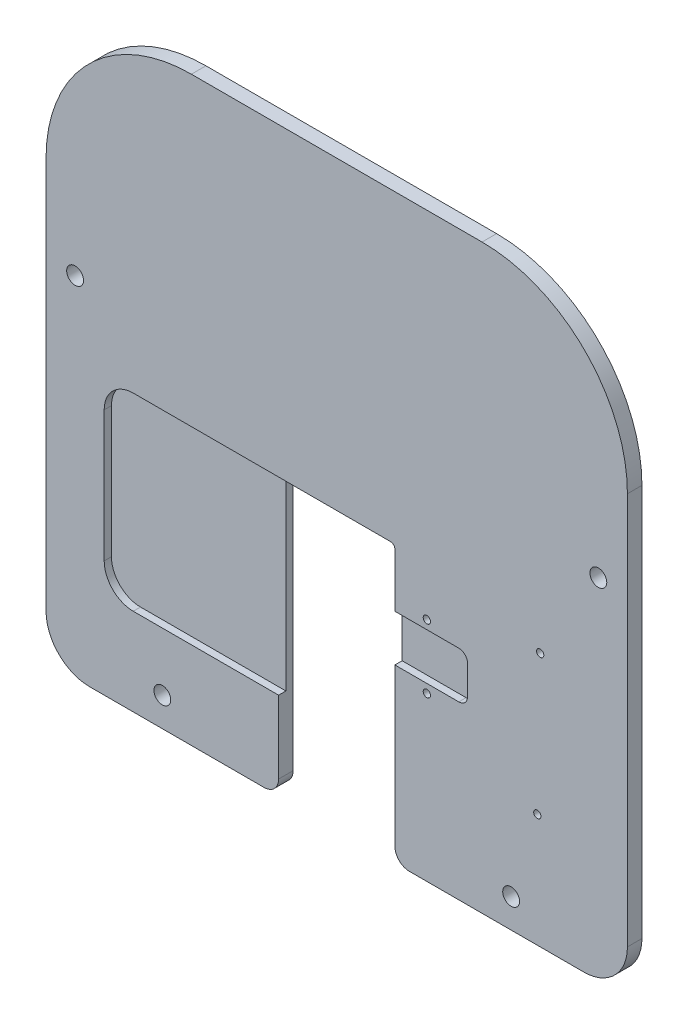
ISO-10303-21;
HEADER;
FILE_DESCRIPTION(('STEP AP214'),'2;1');
FILE_NAME('part.step','',(''),(''),'','','');
FILE_SCHEMA(('AUTOMOTIVE_DESIGN { 1 0 10303 214 1 1 1 1 }'));
ENDSEC;
DATA;
#1=APPLICATION_CONTEXT('core data for automotive mechanical design processes');
#2=APPLICATION_PROTOCOL_DEFINITION('international standard','automotive_design',2000,#1);
#3=PRODUCT_CONTEXT('',#1,'mechanical');
#4=PRODUCT('Part','Part','',(#3));
#5=PRODUCT_RELATED_PRODUCT_CATEGORY('part','',(#4));
#6=PRODUCT_DEFINITION_FORMATION('','',#4);
#7=PRODUCT_DEFINITION_CONTEXT('part definition',#1,'design');
#8=PRODUCT_DEFINITION('design','',#6,#7);
#9=PRODUCT_DEFINITION_SHAPE('','',#8);
#10=(LENGTH_UNIT() NAMED_UNIT(*) SI_UNIT(.MILLI.,.METRE.));
#11=(NAMED_UNIT(*) PLANE_ANGLE_UNIT() SI_UNIT($,.RADIAN.));
#12=(NAMED_UNIT(*) SI_UNIT($,.STERADIAN.) SOLID_ANGLE_UNIT());
#13=UNCERTAINTY_MEASURE_WITH_UNIT(LENGTH_MEASURE(1.E-05),#10,'distance_accuracy_value','');
#14=(GEOMETRIC_REPRESENTATION_CONTEXT(3) GLOBAL_UNCERTAINTY_ASSIGNED_CONTEXT((#13)) GLOBAL_UNIT_ASSIGNED_CONTEXT((#10,
#11,#12)) REPRESENTATION_CONTEXT('',''));
#15=CARTESIAN_POINT('',(0.,0.,0.));
#16=DIRECTION('',(0.,0.,1.));
#17=DIRECTION('',(1.,0.,0.));
#18=AXIS2_PLACEMENT_3D('',#15,#16,#17);
#19=CARTESIAN_POINT('',(-100.,-90.,5.));
#20=DIRECTION('',(0.,1.,0.));
#21=DIRECTION('',(-1.,0.,0.));
#22=AXIS2_PLACEMENT_3D('',#19,#20,#21);
#23=PLANE('',#22);
#24=DIRECTION('',(1.,0.,0.));
#25=VECTOR('',#24,1.);
#26=CARTESIAN_POINT('',(-100.,-90.,0.));
#27=LINE('',#26,#25);
#28=CARTESIAN_POINT('',(-85.,-90.,0.));
#29=VERTEX_POINT('',#28);
#30=CARTESIAN_POINT('',(-25.,-90.,0.));
#31=VERTEX_POINT('',#30);
#32=EDGE_CURVE('E337',#29,#31,#27,.T.);
#33=ORIENTED_EDGE('',*,*,#32,.T.);
#34=DIRECTION('',(0.,0.,1.));
#35=VECTOR('',#34,1.);
#36=CARTESIAN_POINT('',(-25.,-90.,5.));
#37=LINE('',#36,#35);
#38=CARTESIAN_POINT('',(-25.,-90.,5.));
#39=VERTEX_POINT('',#38);
#40=EDGE_CURVE('E394',#31,#39,#37,.T.);
#41=ORIENTED_EDGE('',*,*,#40,.T.);
#42=DIRECTION('',(1.,0.,0.));
#43=VECTOR('',#42,1.);
#44=CARTESIAN_POINT('',(-100.,-90.,5.));
#45=LINE('',#44,#43);
#46=CARTESIAN_POINT('',(-85.,-90.,5.));
#47=VERTEX_POINT('',#46);
#48=EDGE_CURVE('E325',#47,#39,#45,.T.);
#49=ORIENTED_EDGE('',*,*,#48,.F.);
#50=DIRECTION('',(0.,0.,-1.));
#51=VECTOR('',#50,1.);
#52=CARTESIAN_POINT('',(-85.,-90.,5.));
#53=LINE('',#52,#51);
#54=EDGE_CURVE('E374',#47,#29,#53,.T.);
#55=ORIENTED_EDGE('',*,*,#54,.T.);
#56=EDGE_LOOP('',(#33,#41,#49,#55));
#57=FACE_BOUND('',#56,.T.);
#58=ADVANCED_FACE('F31',(#57),#23,.F.);
#59=CARTESIAN_POINT('',(-100.,110.,5.));
#60=DIRECTION('',(1.,0.,0.));
#61=DIRECTION('',(0.,1.,0.));
#62=AXIS2_PLACEMENT_3D('',#59,#60,#61);
#63=PLANE('',#62);
#64=DIRECTION('',(0.,-1.,0.));
#65=VECTOR('',#64,1.);
#66=CARTESIAN_POINT('',(-100.,110.,0.));
#67=LINE('',#66,#65);
#68=CARTESIAN_POINT('',(-100.,60.,0.));
#69=VERTEX_POINT('',#68);
#70=CARTESIAN_POINT('',(-100.,-75.,0.));
#71=VERTEX_POINT('',#70);
#72=EDGE_CURVE('E319',#69,#71,#67,.T.);
#73=ORIENTED_EDGE('',*,*,#72,.T.);
#74=DIRECTION('',(0.,0.,-1.));
#75=VECTOR('',#74,1.);
#76=CARTESIAN_POINT('',(-100.,-75.,5.));
#77=LINE('',#76,#75);
#78=CARTESIAN_POINT('',(-100.,-75.,5.));
#79=VERTEX_POINT('',#78);
#80=EDGE_CURVE('E382',#71,#79,#77,.F.);
#81=ORIENTED_EDGE('',*,*,#80,.T.);
#82=DIRECTION('',(0.,-1.,0.));
#83=VECTOR('',#82,1.);
#84=CARTESIAN_POINT('',(-100.,110.,5.));
#85=LINE('',#84,#83);
#86=CARTESIAN_POINT('',(-100.,60.,5.));
#87=VERTEX_POINT('',#86);
#88=EDGE_CURVE('E320',#87,#79,#85,.T.);
#89=ORIENTED_EDGE('',*,*,#88,.F.);
#90=DIRECTION('',(0.,0.,-1.));
#91=VECTOR('',#90,1.);
#92=CARTESIAN_POINT('',(-100.,60.,5.));
#93=LINE('',#92,#91);
#94=EDGE_CURVE('E360',#87,#69,#93,.T.);
#95=ORIENTED_EDGE('',*,*,#94,.T.);
#96=EDGE_LOOP('',(#73,#81,#89,#95));
#97=FACE_BOUND('',#96,.T.);
#98=ADVANCED_FACE('F503',(#97),#63,.F.);
#99=CARTESIAN_POINT('',(25.,-90.,5.));
#100=VERTEX_POINT('',#99);
#101=CARTESIAN_POINT('',(85.,-90.,5.));
#102=VERTEX_POINT('',#101);
#103=EDGE_CURVE('E323',#100,#102,#45,.T.);
#104=ORIENTED_EDGE('',*,*,#103,.F.);
#105=DIRECTION('',(0.,0.,1.));
#106=VECTOR('',#105,1.);
#107=CARTESIAN_POINT('',(25.,-90.,5.));
#108=LINE('',#107,#106);
#109=CARTESIAN_POINT('',(25.,-90.,0.));
#110=VERTEX_POINT('',#109);
#111=EDGE_CURVE('E410',#100,#110,#108,.F.);
#112=ORIENTED_EDGE('',*,*,#111,.T.);
#113=CARTESIAN_POINT('',(85.,-90.,0.));
#114=VERTEX_POINT('',#113);
#115=EDGE_CURVE('E336',#110,#114,#27,.T.);
#116=ORIENTED_EDGE('',*,*,#115,.T.);
#117=DIRECTION('',(0.,0.,-1.));
#118=VECTOR('',#117,1.);
#119=CARTESIAN_POINT('',(85.,-90.,5.));
#120=LINE('',#119,#118);
#121=EDGE_CURVE('E391',#114,#102,#120,.F.);
#122=ORIENTED_EDGE('',*,*,#121,.T.);
#123=EDGE_LOOP('',(#104,#112,#116,#122));
#124=FACE_BOUND('',#123,.T.);
#125=ADVANCED_FACE('F475',(#124),#23,.F.);
#126=CARTESIAN_POINT('',(100.,110.,5.));
#127=DIRECTION('',(-1.,0.,0.));
#128=DIRECTION('',(0.,-1.,0.));
#129=AXIS2_PLACEMENT_3D('',#126,#127,#128);
#130=PLANE('',#129);
#131=DIRECTION('',(0.,1.,0.));
#132=VECTOR('',#131,1.);
#133=CARTESIAN_POINT('',(100.,110.,5.));
#134=LINE('',#133,#132);
#135=CARTESIAN_POINT('',(100.,-74.9999999999999,5.));
#136=VERTEX_POINT('',#135);
#137=CARTESIAN_POINT('',(100.,60.,5.));
#138=VERTEX_POINT('',#137);
#139=EDGE_CURVE('E328',#136,#138,#134,.T.);
#140=ORIENTED_EDGE('',*,*,#139,.F.);
#141=DIRECTION('',(0.,0.,-1.));
#142=VECTOR('',#141,1.);
#143=CARTESIAN_POINT('',(100.,-75.,5.));
#144=LINE('',#143,#142);
#145=CARTESIAN_POINT('',(100.,-74.9999999999999,0.));
#146=VERTEX_POINT('',#145);
#147=EDGE_CURVE('E388',#136,#146,#144,.T.);
#148=ORIENTED_EDGE('',*,*,#147,.T.);
#149=DIRECTION('',(0.,1.,0.));
#150=VECTOR('',#149,1.);
#151=CARTESIAN_POINT('',(100.,110.,0.));
#152=LINE('',#151,#150);
#153=CARTESIAN_POINT('',(100.,60.,0.));
#154=VERTEX_POINT('',#153);
#155=EDGE_CURVE('E340',#146,#154,#152,.T.);
#156=ORIENTED_EDGE('',*,*,#155,.T.);
#157=DIRECTION('',(0.,0.,-1.));
#158=VECTOR('',#157,1.);
#159=CARTESIAN_POINT('',(100.,60.,5.));
#160=LINE('',#159,#158);
#161=EDGE_CURVE('E353',#154,#138,#160,.F.);
#162=ORIENTED_EDGE('',*,*,#161,.T.);
#163=EDGE_LOOP('',(#140,#148,#156,#162));
#164=FACE_BOUND('',#163,.T.);
#165=ADVANCED_FACE('F484',(#164),#130,.F.);
#166=CARTESIAN_POINT('',(-100.,110.,5.));
#167=DIRECTION('',(0.,-1.,0.));
#168=DIRECTION('',(1.,0.,0.));
#169=AXIS2_PLACEMENT_3D('',#166,#167,#168);
#170=PLANE('',#169);
#171=DIRECTION('',(-1.,0.,0.));
#172=VECTOR('',#171,1.);
#173=CARTESIAN_POINT('',(-100.,110.,5.));
#174=LINE('',#173,#172);
#175=CARTESIAN_POINT('',(50.,110.,5.));
#176=VERTEX_POINT('',#175);
#177=CARTESIAN_POINT('',(-50.,110.,5.));
#178=VERTEX_POINT('',#177);
#179=EDGE_CURVE('E330',#176,#178,#174,.T.);
#180=ORIENTED_EDGE('',*,*,#179,.F.);
#181=DIRECTION('',(0.,0.,-1.));
#182=VECTOR('',#181,1.);
#183=CARTESIAN_POINT('',(50.,110.,5.));
#184=LINE('',#183,#182);
#185=CARTESIAN_POINT('',(50.,110.,0.));
#186=VERTEX_POINT('',#185);
#187=EDGE_CURVE('E345',#176,#186,#184,.T.);
#188=ORIENTED_EDGE('',*,*,#187,.T.);
#189=DIRECTION('',(-1.,0.,0.));
#190=VECTOR('',#189,1.);
#191=CARTESIAN_POINT('',(-100.,110.,0.));
#192=LINE('',#191,#190);
#193=CARTESIAN_POINT('',(-50.,110.,0.));
#194=VERTEX_POINT('',#193);
#195=EDGE_CURVE('E324',#186,#194,#192,.T.);
#196=ORIENTED_EDGE('',*,*,#195,.T.);
#197=DIRECTION('',(0.,0.,-1.));
#198=VECTOR('',#197,1.);
#199=CARTESIAN_POINT('',(-50.,110.,5.));
#200=LINE('',#199,#198);
#201=EDGE_CURVE('E333',#194,#178,#200,.F.);
#202=ORIENTED_EDGE('',*,*,#201,.T.);
#203=EDGE_LOOP('',(#180,#188,#196,#202));
#204=FACE_BOUND('',#203,.T.);
#205=ADVANCED_FACE('F494',(#204),#170,.F.);
#206=CARTESIAN_POINT('',(-100.,-90.,5.));
#207=DIRECTION('',(0.,0.,1.));
#208=DIRECTION('',(1.,0.,0.));
#209=AXIS2_PLACEMENT_3D('',#206,#207,#208);
#210=PLANE('',#209);
#211=DIRECTION('',(-1.,0.,0.));
#212=VECTOR('',#211,1.);
#213=CARTESIAN_POINT('',(20.,-15.,5.));
#214=LINE('',#213,#212);
#215=CARTESIAN_POINT('',(42.,-15.,5.));
#216=VERTEX_POINT('',#215);
#217=CARTESIAN_POINT('',(20.,-15.,5.));
#218=VERTEX_POINT('',#217);
#219=EDGE_CURVE('E222',#216,#218,#214,.T.);
#220=ORIENTED_EDGE('',*,*,#219,.F.);
#221=CARTESIAN_POINT('',(42.,-18.,5.));
#222=DIRECTION('',(0.,0.,1.));
#223=DIRECTION('',(1.,0.,0.));
#224=AXIS2_PLACEMENT_3D('',#221,#222,#223);
#225=CIRCLE('',#224,3.);
#226=CARTESIAN_POINT('',(45.,-18.,5.));
#227=VERTEX_POINT('',#226);
#228=EDGE_CURVE('E11',#216,#227,#225,.F.);
#229=ORIENTED_EDGE('',*,*,#228,.T.);
#230=DIRECTION('',(0.,1.,0.));
#231=VECTOR('',#230,1.);
#232=CARTESIAN_POINT('',(45.,-15.,5.));
#233=LINE('',#232,#231);
#234=CARTESIAN_POINT('',(45.,-28.,5.));
#235=VERTEX_POINT('',#234);
#236=EDGE_CURVE('E447',#235,#227,#233,.T.);
#237=ORIENTED_EDGE('',*,*,#236,.F.);
#238=CARTESIAN_POINT('',(42.,-28.,5.));
#239=DIRECTION('',(0.,0.,1.));
#240=DIRECTION('',(1.,0.,0.));
#241=AXIS2_PLACEMENT_3D('',#238,#239,#240);
#242=CIRCLE('',#241,3.);
#243=CARTESIAN_POINT('',(42.,-31.,5.));
#244=VERTEX_POINT('',#243);
#245=EDGE_CURVE('E39',#235,#244,#242,.F.);
#246=ORIENTED_EDGE('',*,*,#245,.T.);
#247=DIRECTION('',(1.,0.,0.));
#248=VECTOR('',#247,1.);
#249=CARTESIAN_POINT('',(20.,-31.,5.));
#250=LINE('',#249,#248);
#251=CARTESIAN_POINT('',(20.,-31.,5.));
#252=VERTEX_POINT('',#251);
#253=EDGE_CURVE('E445',#252,#244,#250,.T.);
#254=ORIENTED_EDGE('',*,*,#253,.F.);
#255=DIRECTION('',(0.,1.,0.));
#256=VECTOR('',#255,1.);
#257=CARTESIAN_POINT('',(20.,5.,5.));
#258=LINE('',#257,#256);
#259=CARTESIAN_POINT('',(20.,-85.,5.));
#260=VERTEX_POINT('',#259);
#261=EDGE_CURVE('E228',#260,#252,#258,.T.);
#262=ORIENTED_EDGE('',*,*,#261,.F.);
#263=CARTESIAN_POINT('',(25.,-85.,5.));
#264=DIRECTION('',(0.,0.,1.));
#265=DIRECTION('',(1.,0.,0.));
#266=AXIS2_PLACEMENT_3D('',#263,#264,#265);
#267=CIRCLE('',#266,5.);
#268=EDGE_CURVE('E397',#260,#100,#267,.T.);
#269=ORIENTED_EDGE('',*,*,#268,.T.);
#270=ORIENTED_EDGE('',*,*,#103,.T.);
#271=CARTESIAN_POINT('',(85.,-75.,5.));
#272=DIRECTION('',(0.,0.,1.));
#273=DIRECTION('',(1.,0.,0.));
#274=AXIS2_PLACEMENT_3D('',#271,#272,#273);
#275=CIRCLE('',#274,15.);
#276=EDGE_CURVE('E384',#102,#136,#275,.T.);
#277=ORIENTED_EDGE('',*,*,#276,.T.);
#278=ORIENTED_EDGE('',*,*,#139,.T.);
#279=CARTESIAN_POINT('',(50.,60.,5.));
#280=DIRECTION('',(0.,0.,1.));
#281=DIRECTION('',(1.,0.,0.));
#282=AXIS2_PLACEMENT_3D('',#279,#280,#281);
#283=CIRCLE('',#282,50.);
#284=EDGE_CURVE('E358',#138,#176,#283,.T.);
#285=ORIENTED_EDGE('',*,*,#284,.T.);
#286=ORIENTED_EDGE('',*,*,#179,.T.);
#287=CARTESIAN_POINT('',(-50.,60.,5.));
#288=DIRECTION('',(0.,0.,1.));
#289=DIRECTION('',(1.,0.,0.));
#290=AXIS2_PLACEMENT_3D('',#287,#288,#289);
#291=CIRCLE('',#290,50.);
#292=EDGE_CURVE('E356',#178,#87,#291,.T.);
#293=ORIENTED_EDGE('',*,*,#292,.T.);
#294=ORIENTED_EDGE('',*,*,#88,.T.);
#295=CARTESIAN_POINT('',(-85.,-75.,5.));
#296=DIRECTION('',(0.,0.,1.));
#297=DIRECTION('',(1.,0.,0.));
#298=AXIS2_PLACEMENT_3D('',#295,#296,#297);
#299=CIRCLE('',#298,15.);
#300=EDGE_CURVE('E386',#79,#47,#299,.T.);
#301=ORIENTED_EDGE('',*,*,#300,.T.);
#302=ORIENTED_EDGE('',*,*,#48,.T.);
#303=CARTESIAN_POINT('',(-25.,-85.,5.));
#304=DIRECTION('',(0.,0.,1.));
#305=DIRECTION('',(1.,0.,0.));
#306=AXIS2_PLACEMENT_3D('',#303,#304,#305);
#307=CIRCLE('',#306,5.);
#308=CARTESIAN_POINT('',(-20.,-85.,5.));
#309=VERTEX_POINT('',#308);
#310=EDGE_CURVE('E399',#39,#309,#307,.T.);
#311=ORIENTED_EDGE('',*,*,#310,.T.);
#312=DIRECTION('',(0.,-1.,0.));
#313=VECTOR('',#312,1.);
#314=CARTESIAN_POINT('',(-20.,5.,5.));
#315=LINE('',#314,#313);
#316=CARTESIAN_POINT('',(-20.,-60.,5.));
#317=VERTEX_POINT('',#316);
#318=EDGE_CURVE('E302',#317,#309,#315,.T.);
#319=ORIENTED_EDGE('',*,*,#318,.F.);
#320=DIRECTION('',(1.,0.,0.));
#321=VECTOR('',#320,1.);
#322=CARTESIAN_POINT('',(-80.,-60.,5.));
#323=LINE('',#322,#321);
#324=CARTESIAN_POINT('',(-70.,-60.,5.));
#325=VERTEX_POINT('',#324);
#326=EDGE_CURVE('E240',#325,#317,#323,.T.);
#327=ORIENTED_EDGE('',*,*,#326,.F.);
#328=CARTESIAN_POINT('',(-70.,-50.,5.));
#329=DIRECTION('',(0.,0.,1.));
#330=DIRECTION('',(1.,0.,0.));
#331=AXIS2_PLACEMENT_3D('',#328,#329,#330);
#332=CIRCLE('',#331,10.);
#333=CARTESIAN_POINT('',(-80.,-50.,5.));
#334=VERTEX_POINT('',#333);
#335=EDGE_CURVE('E426',#325,#334,#332,.F.);
#336=ORIENTED_EDGE('',*,*,#335,.T.);
#337=DIRECTION('',(0.,-1.,0.));
#338=VECTOR('',#337,1.);
#339=CARTESIAN_POINT('',(-80.,5.,5.));
#340=LINE('',#339,#338);
#341=CARTESIAN_POINT('',(-80.,-5.,5.));
#342=VERTEX_POINT('',#341);
#343=EDGE_CURVE('E231',#342,#334,#340,.T.);
#344=ORIENTED_EDGE('',*,*,#343,.F.);
#345=CARTESIAN_POINT('',(-70.,-5.,5.));
#346=DIRECTION('',(0.,0.,1.));
#347=DIRECTION('',(1.,0.,0.));
#348=AXIS2_PLACEMENT_3D('',#345,#346,#347);
#349=CIRCLE('',#348,10.);
#350=CARTESIAN_POINT('',(-70.,5.,5.));
#351=VERTEX_POINT('',#350);
#352=EDGE_CURVE('E428',#342,#351,#349,.F.);
#353=ORIENTED_EDGE('',*,*,#352,.T.);
#354=DIRECTION('',(-1.,0.,0.));
#355=VECTOR('',#354,1.);
#356=CARTESIAN_POINT('',(-20.,5.,5.));
#357=LINE('',#356,#355);
#358=CARTESIAN_POINT('',(18.5,5.,5.));
#359=VERTEX_POINT('',#358);
#360=EDGE_CURVE('E307',#359,#351,#357,.T.);
#361=ORIENTED_EDGE('',*,*,#360,.F.);
#362=CARTESIAN_POINT('',(18.5,3.5,5.));
#363=DIRECTION('',(0.,0.,1.));
#364=DIRECTION('',(1.,0.,0.));
#365=AXIS2_PLACEMENT_3D('',#362,#363,#364);
#366=CIRCLE('',#365,1.5);
#367=CARTESIAN_POINT('',(20.,3.5,5.));
#368=VERTEX_POINT('',#367);
#369=EDGE_CURVE('E369',#359,#368,#366,.F.);
#370=ORIENTED_EDGE('',*,*,#369,.T.);
#371=EDGE_CURVE('E313',#218,#368,#258,.T.);
#372=ORIENTED_EDGE('',*,*,#371,.F.);
#373=EDGE_LOOP('',(#220,#229,#237,#246,#254,#262,#269,#270,#277,#278,#285,#286,#293,#294,#301,
#302,#311,#319,#327,#336,#344,#353,#361,#370,#372));
#374=FACE_BOUND('',#373,.T.);
#375=CARTESIAN_POINT('',(60.,-80.,5.));
#376=DIRECTION('',(0.,0.,-1.));
#377=DIRECTION('',(-1.,0.,0.));
#378=AXIS2_PLACEMENT_3D('',#375,#376,#377);
#379=CIRCLE('',#378,2.89999999999999);
#380=CARTESIAN_POINT('',(57.1,-80.,5.));
#381=VERTEX_POINT('',#380);
#382=EDGE_CURVE('E257',#381,#381,#379,.T.);
#383=ORIENTED_EDGE('',*,*,#382,.T.);
#384=EDGE_LOOP('',(#383));
#385=FACE_BOUND('',#384,.T.);
#386=CARTESIAN_POINT('',(-60.,-80.,5.));
#387=DIRECTION('',(0.,0.,-1.));
#388=DIRECTION('',(-1.,0.,0.));
#389=AXIS2_PLACEMENT_3D('',#386,#387,#388);
#390=CIRCLE('',#389,2.89999999999999);
#391=CARTESIAN_POINT('',(-62.9,-80.,5.));
#392=VERTEX_POINT('',#391);
#393=EDGE_CURVE('E263',#392,#392,#390,.T.);
#394=ORIENTED_EDGE('',*,*,#393,.T.);
#395=EDGE_LOOP('',(#394));
#396=FACE_BOUND('',#395,.T.);
#397=CARTESIAN_POINT('',(90.,30.,5.));
#398=DIRECTION('',(0.,0.,-1.));
#399=DIRECTION('',(-1.,0.,0.));
#400=AXIS2_PLACEMENT_3D('',#397,#398,#399);
#401=CIRCLE('',#400,2.89999999999999);
#402=CARTESIAN_POINT('',(87.1,30.,5.));
#403=VERTEX_POINT('',#402);
#404=EDGE_CURVE('E269',#403,#403,#401,.T.);
#405=ORIENTED_EDGE('',*,*,#404,.T.);
#406=EDGE_LOOP('',(#405));
#407=FACE_BOUND('',#406,.T.);
#408=CARTESIAN_POINT('',(-90.,30.,5.));
#409=DIRECTION('',(0.,0.,-1.));
#410=DIRECTION('',(-1.,0.,0.));
#411=AXIS2_PLACEMENT_3D('',#408,#409,#410);
#412=CIRCLE('',#411,2.89999999999999);
#413=CARTESIAN_POINT('',(-92.9,30.,5.));
#414=VERTEX_POINT('',#413);
#415=EDGE_CURVE('E275',#414,#414,#412,.T.);
#416=ORIENTED_EDGE('',*,*,#415,.T.);
#417=EDGE_LOOP('',(#416));
#418=FACE_BOUND('',#417,.T.);
#419=CARTESIAN_POINT('',(70.,-2.5,5.));
#420=DIRECTION('',(0.,0.,1.));
#421=DIRECTION('',(1.,0.,0.));
#422=AXIS2_PLACEMENT_3D('',#419,#420,#421);
#423=CIRCLE('',#422,1.24999999999999);
#424=CARTESIAN_POINT('',(71.25,-2.5,5.));
#425=VERTEX_POINT('',#424);
#426=EDGE_CURVE('E278',#425,#425,#423,.T.);
#427=ORIENTED_EDGE('',*,*,#426,.F.);
#428=EDGE_LOOP('',(#427));
#429=FACE_BOUND('',#428,.T.);
#430=CARTESIAN_POINT('',(31.,-12.,5.));
#431=DIRECTION('',(0.,0.,1.));
#432=DIRECTION('',(1.,0.,0.));
#433=AXIS2_PLACEMENT_3D('',#430,#431,#432);
#434=CIRCLE('',#433,1.24999999999999);
#435=CARTESIAN_POINT('',(32.25,-12.,5.));
#436=VERTEX_POINT('',#435);
#437=EDGE_CURVE('E284',#436,#436,#434,.T.);
#438=ORIENTED_EDGE('',*,*,#437,.F.);
#439=EDGE_LOOP('',(#438));
#440=FACE_BOUND('',#439,.T.);
#441=CARTESIAN_POINT('',(31.,-34.,5.));
#442=DIRECTION('',(0.,0.,1.));
#443=DIRECTION('',(1.,0.,0.));
#444=AXIS2_PLACEMENT_3D('',#441,#442,#443);
#445=CIRCLE('',#444,1.24999999999999);
#446=CARTESIAN_POINT('',(32.25,-34.,5.));
#447=VERTEX_POINT('',#446);
#448=EDGE_CURVE('E290',#447,#447,#445,.T.);
#449=ORIENTED_EDGE('',*,*,#448,.F.);
#450=EDGE_LOOP('',(#449));
#451=FACE_BOUND('',#450,.T.);
#452=CARTESIAN_POINT('',(69.,-51.,5.));
#453=DIRECTION('',(0.,0.,1.));
#454=DIRECTION('',(1.,0.,0.));
#455=AXIS2_PLACEMENT_3D('',#452,#453,#454);
#456=CIRCLE('',#455,1.24999999999999);
#457=CARTESIAN_POINT('',(70.25,-51.,5.));
#458=VERTEX_POINT('',#457);
#459=EDGE_CURVE('E296',#458,#458,#456,.T.);
#460=ORIENTED_EDGE('',*,*,#459,.F.);
#461=EDGE_LOOP('',(#460));
#462=FACE_BOUND('',#461,.T.);
#463=ADVANCED_FACE('F443',(#374,#385,#396,#407,#418,#429,#440,#451,#462),#210,.T.);
#464=CARTESIAN_POINT('',(-100.,-90.,0.));
#465=DIRECTION('',(0.,0.,1.));
#466=DIRECTION('',(1.,0.,0.));
#467=AXIS2_PLACEMENT_3D('',#464,#465,#466);
#468=PLANE('',#467);
#469=CARTESIAN_POINT('',(60.,-80.,0.));
#470=DIRECTION('',(0.,0.,-1.));
#471=DIRECTION('',(-1.,0.,0.));
#472=AXIS2_PLACEMENT_3D('',#469,#470,#471);
#473=CIRCLE('',#472,2.89999999999999);
#474=CARTESIAN_POINT('',(57.1,-80.,0.));
#475=VERTEX_POINT('',#474);
#476=EDGE_CURVE('E254',#475,#475,#473,.T.);
#477=ORIENTED_EDGE('',*,*,#476,.F.);
#478=EDGE_LOOP('',(#477));
#479=FACE_BOUND('',#478,.T.);
#480=CARTESIAN_POINT('',(-60.,-80.,0.));
#481=DIRECTION('',(0.,0.,-1.));
#482=DIRECTION('',(-1.,0.,0.));
#483=AXIS2_PLACEMENT_3D('',#480,#481,#482);
#484=CIRCLE('',#483,2.89999999999999);
#485=CARTESIAN_POINT('',(-62.9,-80.,0.));
#486=VERTEX_POINT('',#485);
#487=EDGE_CURVE('E260',#486,#486,#484,.T.);
#488=ORIENTED_EDGE('',*,*,#487,.F.);
#489=EDGE_LOOP('',(#488));
#490=FACE_BOUND('',#489,.T.);
#491=CARTESIAN_POINT('',(90.,30.,0.));
#492=DIRECTION('',(0.,0.,-1.));
#493=DIRECTION('',(-1.,0.,0.));
#494=AXIS2_PLACEMENT_3D('',#491,#492,#493);
#495=CIRCLE('',#494,2.89999999999999);
#496=CARTESIAN_POINT('',(87.1,30.,0.));
#497=VERTEX_POINT('',#496);
#498=EDGE_CURVE('E266',#497,#497,#495,.T.);
#499=ORIENTED_EDGE('',*,*,#498,.F.);
#500=EDGE_LOOP('',(#499));
#501=FACE_BOUND('',#500,.T.);
#502=CARTESIAN_POINT('',(-90.,30.,0.));
#503=DIRECTION('',(0.,0.,-1.));
#504=DIRECTION('',(-1.,0.,0.));
#505=AXIS2_PLACEMENT_3D('',#502,#503,#504);
#506=CIRCLE('',#505,2.89999999999999);
#507=CARTESIAN_POINT('',(-92.9,30.,0.));
#508=VERTEX_POINT('',#507);
#509=EDGE_CURVE('E272',#508,#508,#506,.T.);
#510=ORIENTED_EDGE('',*,*,#509,.F.);
#511=EDGE_LOOP('',(#510));
#512=FACE_BOUND('',#511,.T.);
#513=CARTESIAN_POINT('',(70.,-2.5,0.));
#514=DIRECTION('',(0.,0.,1.));
#515=DIRECTION('',(1.,0.,0.));
#516=AXIS2_PLACEMENT_3D('',#513,#514,#515);
#517=CIRCLE('',#516,1.24999999999999);
#518=CARTESIAN_POINT('',(71.25,-2.5,0.));
#519=VERTEX_POINT('',#518);
#520=EDGE_CURVE('E281',#519,#519,#517,.T.);
#521=ORIENTED_EDGE('',*,*,#520,.T.);
#522=EDGE_LOOP('',(#521));
#523=FACE_BOUND('',#522,.T.);
#524=CARTESIAN_POINT('',(31.,-12.,0.));
#525=DIRECTION('',(0.,0.,1.));
#526=DIRECTION('',(1.,0.,0.));
#527=AXIS2_PLACEMENT_3D('',#524,#525,#526);
#528=CIRCLE('',#527,1.24999999999999);
#529=CARTESIAN_POINT('',(32.25,-12.,0.));
#530=VERTEX_POINT('',#529);
#531=EDGE_CURVE('E287',#530,#530,#528,.T.);
#532=ORIENTED_EDGE('',*,*,#531,.T.);
#533=EDGE_LOOP('',(#532));
#534=FACE_BOUND('',#533,.T.);
#535=CARTESIAN_POINT('',(31.,-34.,0.));
#536=DIRECTION('',(0.,0.,1.));
#537=DIRECTION('',(1.,0.,0.));
#538=AXIS2_PLACEMENT_3D('',#535,#536,#537);
#539=CIRCLE('',#538,1.24999999999999);
#540=CARTESIAN_POINT('',(32.25,-34.,0.));
#541=VERTEX_POINT('',#540);
#542=EDGE_CURVE('E293',#541,#541,#539,.T.);
#543=ORIENTED_EDGE('',*,*,#542,.T.);
#544=EDGE_LOOP('',(#543));
#545=FACE_BOUND('',#544,.T.);
#546=CARTESIAN_POINT('',(69.,-51.,0.));
#547=DIRECTION('',(0.,0.,1.));
#548=DIRECTION('',(1.,0.,0.));
#549=AXIS2_PLACEMENT_3D('',#546,#547,#548);
#550=CIRCLE('',#549,1.24999999999999);
#551=CARTESIAN_POINT('',(70.25,-51.,0.));
#552=VERTEX_POINT('',#551);
#553=EDGE_CURVE('E299',#552,#552,#550,.T.);
#554=ORIENTED_EDGE('',*,*,#553,.T.);
#555=EDGE_LOOP('',(#554));
#556=FACE_BOUND('',#555,.T.);
#557=DIRECTION('',(0.,-1.,0.));
#558=VECTOR('',#557,1.);
#559=CARTESIAN_POINT('',(-20.,5.,0.));
#560=LINE('',#559,#558);
#561=CARTESIAN_POINT('',(-20.,5.,0.));
#562=VERTEX_POINT('',#561);
#563=CARTESIAN_POINT('',(-20.,-85.,0.));
#564=VERTEX_POINT('',#563);
#565=EDGE_CURVE('E303',#562,#564,#560,.T.);
#566=ORIENTED_EDGE('',*,*,#565,.T.);
#567=CARTESIAN_POINT('',(-25.,-85.,0.));
#568=DIRECTION('',(0.,0.,1.));
#569=DIRECTION('',(1.,0.,0.));
#570=AXIS2_PLACEMENT_3D('',#567,#568,#569);
#571=CIRCLE('',#570,5.);
#572=EDGE_CURVE('E406',#564,#31,#571,.F.);
#573=ORIENTED_EDGE('',*,*,#572,.T.);
#574=ORIENTED_EDGE('',*,*,#32,.F.);
#575=CARTESIAN_POINT('',(-85.,-75.,0.));
#576=DIRECTION('',(0.,0.,1.));
#577=DIRECTION('',(1.,0.,0.));
#578=AXIS2_PLACEMENT_3D('',#575,#576,#577);
#579=CIRCLE('',#578,15.);
#580=EDGE_CURVE('E380',#29,#71,#579,.F.);
#581=ORIENTED_EDGE('',*,*,#580,.T.);
#582=ORIENTED_EDGE('',*,*,#72,.F.);
#583=CARTESIAN_POINT('',(-50.,60.,0.));
#584=DIRECTION('',(0.,0.,1.));
#585=DIRECTION('',(1.,0.,0.));
#586=AXIS2_PLACEMENT_3D('',#583,#584,#585);
#587=CIRCLE('',#586,50.);
#588=EDGE_CURVE('E348',#69,#194,#587,.F.);
#589=ORIENTED_EDGE('',*,*,#588,.T.);
#590=ORIENTED_EDGE('',*,*,#195,.F.);
#591=CARTESIAN_POINT('',(50.,60.,0.));
#592=DIRECTION('',(0.,0.,1.));
#593=DIRECTION('',(1.,0.,0.));
#594=AXIS2_PLACEMENT_3D('',#591,#592,#593);
#595=CIRCLE('',#594,50.);
#596=EDGE_CURVE('E350',#186,#154,#595,.F.);
#597=ORIENTED_EDGE('',*,*,#596,.T.);
#598=ORIENTED_EDGE('',*,*,#155,.F.);
#599=CARTESIAN_POINT('',(85.,-75.,0.));
#600=DIRECTION('',(0.,0.,1.));
#601=DIRECTION('',(1.,0.,0.));
#602=AXIS2_PLACEMENT_3D('',#599,#600,#601);
#603=CIRCLE('',#602,15.);
#604=EDGE_CURVE('E377',#146,#114,#603,.F.);
#605=ORIENTED_EDGE('',*,*,#604,.T.);
#606=ORIENTED_EDGE('',*,*,#115,.F.);
#607=CARTESIAN_POINT('',(25.,-85.,0.));
#608=DIRECTION('',(0.,0.,1.));
#609=DIRECTION('',(1.,0.,0.));
#610=AXIS2_PLACEMENT_3D('',#607,#608,#609);
#611=CIRCLE('',#610,5.);
#612=CARTESIAN_POINT('',(20.,-85.,0.));
#613=VERTEX_POINT('',#612);
#614=EDGE_CURVE('E404',#110,#613,#611,.F.);
#615=ORIENTED_EDGE('',*,*,#614,.T.);
#616=DIRECTION('',(0.,1.,0.));
#617=VECTOR('',#616,1.);
#618=CARTESIAN_POINT('',(20.,5.,0.));
#619=LINE('',#618,#617);
#620=CARTESIAN_POINT('',(20.,3.5,0.));
#621=VERTEX_POINT('',#620);
#622=EDGE_CURVE('E306',#613,#621,#619,.T.);
#623=ORIENTED_EDGE('',*,*,#622,.T.);
#624=CARTESIAN_POINT('',(18.5,3.5,0.));
#625=DIRECTION('',(0.,0.,1.));
#626=DIRECTION('',(1.,0.,0.));
#627=AXIS2_PLACEMENT_3D('',#624,#625,#626);
#628=CIRCLE('',#627,1.5);
#629=CARTESIAN_POINT('',(18.5,5.,0.));
#630=VERTEX_POINT('',#629);
#631=EDGE_CURVE('E372',#621,#630,#628,.T.);
#632=ORIENTED_EDGE('',*,*,#631,.T.);
#633=DIRECTION('',(-1.,0.,0.));
#634=VECTOR('',#633,1.);
#635=CARTESIAN_POINT('',(-20.,5.,0.));
#636=LINE('',#635,#634);
#637=EDGE_CURVE('E309',#630,#562,#636,.T.);
#638=ORIENTED_EDGE('',*,*,#637,.T.);
#639=EDGE_LOOP('',(#566,#573,#574,#581,#582,#589,#590,#597,#598,#605,#606,#615,#623,#632,#638));
#640=FACE_BOUND('',#639,.T.);
#641=ADVANCED_FACE('F545',(#479,#490,#501,#512,#523,#534,#545,#556,#640),#468,.F.);
#642=CARTESIAN_POINT('',(-20.,5.,0.));
#643=DIRECTION('',(-1.,0.,0.));
#644=DIRECTION('',(0.,-1.,0.));
#645=AXIS2_PLACEMENT_3D('',#642,#643,#644);
#646=PLANE('',#645);
#647=DIRECTION('',(0.,1.,0.));
#648=VECTOR('',#647,1.);
#649=CARTESIAN_POINT('',(-20.,5.,2.5));
#650=LINE('',#649,#648);
#651=CARTESIAN_POINT('',(-20.,-60.,2.5));
#652=VERTEX_POINT('',#651);
#653=CARTESIAN_POINT('',(-20.,5.,2.5));
#654=VERTEX_POINT('',#653);
#655=EDGE_CURVE('E242',#652,#654,#650,.T.);
#656=ORIENTED_EDGE('',*,*,#655,.F.);
#657=DIRECTION('',(0.,0.,1.));
#658=VECTOR('',#657,1.);
#659=CARTESIAN_POINT('',(-20.,-60.,2.5));
#660=LINE('',#659,#658);
#661=EDGE_CURVE('E248',#652,#317,#660,.T.);
#662=ORIENTED_EDGE('',*,*,#661,.T.);
#663=ORIENTED_EDGE('',*,*,#318,.T.);
#664=DIRECTION('',(0.,0.,1.));
#665=VECTOR('',#664,1.);
#666=CARTESIAN_POINT('',(-20.,-85.,0.));
#667=LINE('',#666,#665);
#668=EDGE_CURVE('E402',#309,#564,#667,.F.);
#669=ORIENTED_EDGE('',*,*,#668,.T.);
#670=ORIENTED_EDGE('',*,*,#565,.F.);
#671=DIRECTION('',(0.,0.,1.));
#672=VECTOR('',#671,1.);
#673=CARTESIAN_POINT('',(-20.,5.,0.));
#674=LINE('',#673,#672);
#675=EDGE_CURVE('E311',#562,#654,#674,.T.);
#676=ORIENTED_EDGE('',*,*,#675,.T.);
#677=EDGE_LOOP('',(#656,#662,#663,#669,#670,#676));
#678=FACE_BOUND('',#677,.T.);
#679=ADVANCED_FACE('F521',(#678),#646,.F.);
#680=CARTESIAN_POINT('',(-20.,5.,0.));
#681=DIRECTION('',(0.,1.,0.));
#682=DIRECTION('',(0.,0.,1.));
#683=AXIS2_PLACEMENT_3D('',#680,#681,#682);
#684=PLANE('',#683);
#685=ORIENTED_EDGE('',*,*,#360,.T.);
#686=DIRECTION('',(0.,0.,1.));
#687=VECTOR('',#686,1.);
#688=CARTESIAN_POINT('',(-70.,5.,2.5));
#689=LINE('',#688,#687);
#690=CARTESIAN_POINT('',(-70.,5.,2.5));
#691=VERTEX_POINT('',#690);
#692=EDGE_CURVE('E424',#351,#691,#689,.F.);
#693=ORIENTED_EDGE('',*,*,#692,.T.);
#694=DIRECTION('',(-1.,0.,0.));
#695=VECTOR('',#694,1.);
#696=CARTESIAN_POINT('',(-80.,5.,2.5));
#697=LINE('',#696,#695);
#698=EDGE_CURVE('E245',#654,#691,#697,.T.);
#699=ORIENTED_EDGE('',*,*,#698,.F.);
#700=ORIENTED_EDGE('',*,*,#675,.F.);
#701=ORIENTED_EDGE('',*,*,#637,.F.);
#702=DIRECTION('',(0.,0.,1.));
#703=VECTOR('',#702,1.);
#704=CARTESIAN_POINT('',(18.5,5.,5.));
#705=LINE('',#704,#703);
#706=EDGE_CURVE('E363',#630,#359,#705,.T.);
#707=ORIENTED_EDGE('',*,*,#706,.T.);
#708=EDGE_LOOP('',(#685,#693,#699,#700,#701,#707));
#709=FACE_BOUND('',#708,.T.);
#710=ADVANCED_FACE('F542',(#709),#684,.F.);
#711=CARTESIAN_POINT('',(20.,5.,0.));
#712=DIRECTION('',(1.,0.,0.));
#713=DIRECTION('',(0.,1.,0.));
#714=AXIS2_PLACEMENT_3D('',#711,#712,#713);
#715=PLANE('',#714);
#716=DIRECTION('',(0.,-1.,0.));
#717=VECTOR('',#716,1.);
#718=CARTESIAN_POINT('',(20.,-15.,2.5));
#719=LINE('',#718,#717);
#720=CARTESIAN_POINT('',(20.,-15.,2.5));
#721=VERTEX_POINT('',#720);
#722=CARTESIAN_POINT('',(20.,-31.,2.5));
#723=VERTEX_POINT('',#722);
#724=EDGE_CURVE('E214',#721,#723,#719,.T.);
#725=ORIENTED_EDGE('',*,*,#724,.F.);
#726=DIRECTION('',(0.,0.,1.));
#727=VECTOR('',#726,1.);
#728=CARTESIAN_POINT('',(20.,-15.,2.5));
#729=LINE('',#728,#727);
#730=EDGE_CURVE('E229',#721,#218,#729,.T.);
#731=ORIENTED_EDGE('',*,*,#730,.T.);
#732=ORIENTED_EDGE('',*,*,#371,.T.);
#733=DIRECTION('',(0.,0.,1.));
#734=VECTOR('',#733,1.);
#735=CARTESIAN_POINT('',(20.,3.5,0.));
#736=LINE('',#735,#734);
#737=EDGE_CURVE('E366',#368,#621,#736,.F.);
#738=ORIENTED_EDGE('',*,*,#737,.T.);
#739=ORIENTED_EDGE('',*,*,#622,.F.);
#740=DIRECTION('',(0.,0.,1.));
#741=VECTOR('',#740,1.);
#742=CARTESIAN_POINT('',(20.,-85.,0.));
#743=LINE('',#742,#741);
#744=EDGE_CURVE('E408',#613,#260,#743,.T.);
#745=ORIENTED_EDGE('',*,*,#744,.T.);
#746=ORIENTED_EDGE('',*,*,#261,.T.);
#747=DIRECTION('',(0.,0.,1.));
#748=VECTOR('',#747,1.);
#749=CARTESIAN_POINT('',(20.,-31.,2.5));
#750=LINE('',#749,#748);
#751=EDGE_CURVE('E208',#723,#252,#750,.T.);
#752=ORIENTED_EDGE('',*,*,#751,.F.);
#753=EDGE_LOOP('',(#725,#731,#732,#738,#739,#745,#746,#752));
#754=FACE_BOUND('',#753,.T.);
#755=ADVANCED_FACE('F225',(#754),#715,.F.);
#756=CARTESIAN_POINT('',(50.,60.,5.));
#757=DIRECTION('',(0.,0.,-1.));
#758=DIRECTION('',(-1.,0.,0.));
#759=AXIS2_PLACEMENT_3D('',#756,#757,#758);
#760=CYLINDRICAL_SURFACE('',#759,50.);
#761=ORIENTED_EDGE('',*,*,#284,.F.);
#762=ORIENTED_EDGE('',*,*,#161,.F.);
#763=ORIENTED_EDGE('',*,*,#596,.F.);
#764=ORIENTED_EDGE('',*,*,#187,.F.);
#765=EDGE_LOOP('',(#761,#762,#763,#764));
#766=FACE_BOUND('',#765,.T.);
#767=ADVANCED_FACE('F490',(#766),#760,.T.);
#768=CARTESIAN_POINT('',(-50.,60.,5.));
#769=DIRECTION('',(0.,0.,-1.));
#770=DIRECTION('',(-1.,0.,0.));
#771=AXIS2_PLACEMENT_3D('',#768,#769,#770);
#772=CYLINDRICAL_SURFACE('',#771,50.);
#773=ORIENTED_EDGE('',*,*,#292,.F.);
#774=ORIENTED_EDGE('',*,*,#201,.F.);
#775=ORIENTED_EDGE('',*,*,#588,.F.);
#776=ORIENTED_EDGE('',*,*,#94,.F.);
#777=EDGE_LOOP('',(#773,#774,#775,#776));
#778=FACE_BOUND('',#777,.T.);
#779=ADVANCED_FACE('F498',(#778),#772,.T.);
#780=CARTESIAN_POINT('',(18.5,3.5,0.));
#781=DIRECTION('',(0.,0.,-1.));
#782=DIRECTION('',(-1.,0.,0.));
#783=AXIS2_PLACEMENT_3D('',#780,#781,#782);
#784=CYLINDRICAL_SURFACE('',#783,1.5);
#785=ORIENTED_EDGE('',*,*,#631,.F.);
#786=ORIENTED_EDGE('',*,*,#737,.F.);
#787=ORIENTED_EDGE('',*,*,#369,.F.);
#788=ORIENTED_EDGE('',*,*,#706,.F.);
#789=EDGE_LOOP('',(#785,#786,#787,#788));
#790=FACE_BOUND('',#789,.T.);
#791=ADVANCED_FACE('F465',(#790),#784,.F.);
#792=CARTESIAN_POINT('',(69.,-51.,5.));
#793=DIRECTION('',(0.,0.,1.));
#794=DIRECTION('',(1.,0.,0.));
#795=AXIS2_PLACEMENT_3D('',#792,#793,#794);
#796=CYLINDRICAL_SURFACE('',#795,1.24999999999999);
#797=ORIENTED_EDGE('',*,*,#553,.F.);
#798=EDGE_LOOP('',(#797));
#799=FACE_BOUND('',#798,.T.);
#800=ORIENTED_EDGE('',*,*,#459,.T.);
#801=EDGE_LOOP('',(#800));
#802=FACE_BOUND('',#801,.T.);
#803=ADVANCED_FACE('F654',(#799,#802),#796,.F.);
#804=CARTESIAN_POINT('',(31.,-34.,5.));
#805=DIRECTION('',(0.,0.,1.));
#806=DIRECTION('',(1.,0.,0.));
#807=AXIS2_PLACEMENT_3D('',#804,#805,#806);
#808=CYLINDRICAL_SURFACE('',#807,1.24999999999999);
#809=ORIENTED_EDGE('',*,*,#542,.F.);
#810=EDGE_LOOP('',(#809));
#811=FACE_BOUND('',#810,.T.);
#812=ORIENTED_EDGE('',*,*,#448,.T.);
#813=EDGE_LOOP('',(#812));
#814=FACE_BOUND('',#813,.T.);
#815=ADVANCED_FACE('F666',(#811,#814),#808,.F.);
#816=CARTESIAN_POINT('',(31.,-12.,5.));
#817=DIRECTION('',(0.,0.,1.));
#818=DIRECTION('',(1.,0.,0.));
#819=AXIS2_PLACEMENT_3D('',#816,#817,#818);
#820=CYLINDRICAL_SURFACE('',#819,1.24999999999999);
#821=ORIENTED_EDGE('',*,*,#531,.F.);
#822=EDGE_LOOP('',(#821));
#823=FACE_BOUND('',#822,.T.);
#824=ORIENTED_EDGE('',*,*,#437,.T.);
#825=EDGE_LOOP('',(#824));
#826=FACE_BOUND('',#825,.T.);
#827=ADVANCED_FACE('F670',(#823,#826),#820,.F.);
#828=CARTESIAN_POINT('',(70.,-2.5,5.));
#829=DIRECTION('',(0.,0.,1.));
#830=DIRECTION('',(1.,0.,0.));
#831=AXIS2_PLACEMENT_3D('',#828,#829,#830);
#832=CYLINDRICAL_SURFACE('',#831,1.24999999999999);
#833=ORIENTED_EDGE('',*,*,#520,.F.);
#834=EDGE_LOOP('',(#833));
#835=FACE_BOUND('',#834,.T.);
#836=ORIENTED_EDGE('',*,*,#426,.T.);
#837=EDGE_LOOP('',(#836));
#838=FACE_BOUND('',#837,.T.);
#839=ADVANCED_FACE('F651',(#835,#838),#832,.F.);
#840=CARTESIAN_POINT('',(-85.,-75.,5.));
#841=DIRECTION('',(0.,0.,-1.));
#842=DIRECTION('',(-1.,0.,0.));
#843=AXIS2_PLACEMENT_3D('',#840,#841,#842);
#844=CYLINDRICAL_SURFACE('',#843,15.);
#845=ORIENTED_EDGE('',*,*,#300,.F.);
#846=ORIENTED_EDGE('',*,*,#80,.F.);
#847=ORIENTED_EDGE('',*,*,#580,.F.);
#848=ORIENTED_EDGE('',*,*,#54,.F.);
#849=EDGE_LOOP('',(#845,#846,#847,#848));
#850=FACE_BOUND('',#849,.T.);
#851=ADVANCED_FACE('F507',(#850),#844,.T.);
#852=CARTESIAN_POINT('',(85.,-75.,5.));
#853=DIRECTION('',(0.,0.,-1.));
#854=DIRECTION('',(-1.,0.,0.));
#855=AXIS2_PLACEMENT_3D('',#852,#853,#854);
#856=CYLINDRICAL_SURFACE('',#855,15.);
#857=ORIENTED_EDGE('',*,*,#276,.F.);
#858=ORIENTED_EDGE('',*,*,#121,.F.);
#859=ORIENTED_EDGE('',*,*,#604,.F.);
#860=ORIENTED_EDGE('',*,*,#147,.F.);
#861=EDGE_LOOP('',(#857,#858,#859,#860));
#862=FACE_BOUND('',#861,.T.);
#863=ADVANCED_FACE('F481',(#862),#856,.T.);
#864=CARTESIAN_POINT('',(-25.,-85.,5.));
#865=DIRECTION('',(0.,0.,1.));
#866=DIRECTION('',(1.,0.,0.));
#867=AXIS2_PLACEMENT_3D('',#864,#865,#866);
#868=CYLINDRICAL_SURFACE('',#867,5.);
#869=ORIENTED_EDGE('',*,*,#572,.F.);
#870=ORIENTED_EDGE('',*,*,#668,.F.);
#871=ORIENTED_EDGE('',*,*,#310,.F.);
#872=ORIENTED_EDGE('',*,*,#40,.F.);
#873=EDGE_LOOP('',(#869,#870,#871,#872));
#874=FACE_BOUND('',#873,.T.);
#875=ADVANCED_FACE('F515',(#874),#868,.T.);
#876=CARTESIAN_POINT('',(25.,-85.,0.));
#877=DIRECTION('',(0.,0.,1.));
#878=DIRECTION('',(1.,0.,0.));
#879=AXIS2_PLACEMENT_3D('',#876,#877,#878);
#880=CYLINDRICAL_SURFACE('',#879,5.);
#881=ORIENTED_EDGE('',*,*,#614,.F.);
#882=ORIENTED_EDGE('',*,*,#111,.F.);
#883=ORIENTED_EDGE('',*,*,#268,.F.);
#884=ORIENTED_EDGE('',*,*,#744,.F.);
#885=EDGE_LOOP('',(#881,#882,#883,#884));
#886=FACE_BOUND('',#885,.T.);
#887=ADVANCED_FACE('F471',(#886),#880,.T.);
#888=CARTESIAN_POINT('',(-90.,30.,0.));
#889=DIRECTION('',(0.,0.,-1.));
#890=DIRECTION('',(-1.,0.,0.));
#891=AXIS2_PLACEMENT_3D('',#888,#889,#890);
#892=CYLINDRICAL_SURFACE('',#891,2.89999999999999);
#893=ORIENTED_EDGE('',*,*,#415,.F.);
#894=EDGE_LOOP('',(#893));
#895=FACE_BOUND('',#894,.T.);
#896=ORIENTED_EDGE('',*,*,#509,.T.);
#897=EDGE_LOOP('',(#896));
#898=FACE_BOUND('',#897,.T.);
#899=ADVANCED_FACE('F644',(#895,#898),#892,.F.);
#900=CARTESIAN_POINT('',(90.,30.,0.));
#901=DIRECTION('',(0.,0.,-1.));
#902=DIRECTION('',(-1.,0.,0.));
#903=AXIS2_PLACEMENT_3D('',#900,#901,#902);
#904=CYLINDRICAL_SURFACE('',#903,2.89999999999999);
#905=ORIENTED_EDGE('',*,*,#404,.F.);
#906=EDGE_LOOP('',(#905));
#907=FACE_BOUND('',#906,.T.);
#908=ORIENTED_EDGE('',*,*,#498,.T.);
#909=EDGE_LOOP('',(#908));
#910=FACE_BOUND('',#909,.T.);
#911=ADVANCED_FACE('F680',(#907,#910),#904,.F.);
#912=CARTESIAN_POINT('',(-60.,-80.,0.));
#913=DIRECTION('',(0.,0.,-1.));
#914=DIRECTION('',(-1.,0.,0.));
#915=AXIS2_PLACEMENT_3D('',#912,#913,#914);
#916=CYLINDRICAL_SURFACE('',#915,2.89999999999999);
#917=ORIENTED_EDGE('',*,*,#393,.F.);
#918=EDGE_LOOP('',(#917));
#919=FACE_BOUND('',#918,.T.);
#920=ORIENTED_EDGE('',*,*,#487,.T.);
#921=EDGE_LOOP('',(#920));
#922=FACE_BOUND('',#921,.T.);
#923=ADVANCED_FACE('F684',(#919,#922),#916,.F.);
#924=CARTESIAN_POINT('',(60.,-80.,0.));
#925=DIRECTION('',(0.,0.,-1.));
#926=DIRECTION('',(-1.,0.,0.));
#927=AXIS2_PLACEMENT_3D('',#924,#925,#926);
#928=CYLINDRICAL_SURFACE('',#927,2.89999999999999);
#929=ORIENTED_EDGE('',*,*,#382,.F.);
#930=EDGE_LOOP('',(#929));
#931=FACE_BOUND('',#930,.T.);
#932=ORIENTED_EDGE('',*,*,#476,.T.);
#933=EDGE_LOOP('',(#932));
#934=FACE_BOUND('',#933,.T.);
#935=ADVANCED_FACE('F688',(#931,#934),#928,.F.);
#936=CARTESIAN_POINT('',(-80.,5.,2.5));
#937=DIRECTION('',(-1.,0.,0.));
#938=DIRECTION('',(0.,-1.,0.));
#939=AXIS2_PLACEMENT_3D('',#936,#937,#938);
#940=PLANE('',#939);
#941=ORIENTED_EDGE('',*,*,#343,.T.);
#942=DIRECTION('',(0.,0.,1.));
#943=VECTOR('',#942,1.);
#944=CARTESIAN_POINT('',(-80.,-50.,2.5));
#945=LINE('',#944,#943);
#946=CARTESIAN_POINT('',(-80.,-50.,2.5));
#947=VERTEX_POINT('',#946);
#948=EDGE_CURVE('E418',#334,#947,#945,.F.);
#949=ORIENTED_EDGE('',*,*,#948,.T.);
#950=DIRECTION('',(0.,-1.,0.));
#951=VECTOR('',#950,1.);
#952=CARTESIAN_POINT('',(-80.,5.,2.5));
#953=LINE('',#952,#951);
#954=CARTESIAN_POINT('',(-80.,-5.,2.5));
#955=VERTEX_POINT('',#954);
#956=EDGE_CURVE('E236',#955,#947,#953,.T.);
#957=ORIENTED_EDGE('',*,*,#956,.F.);
#958=DIRECTION('',(0.,0.,1.));
#959=VECTOR('',#958,1.);
#960=CARTESIAN_POINT('',(-80.,-5.,5.));
#961=LINE('',#960,#959);
#962=EDGE_CURVE('E415',#955,#342,#961,.T.);
#963=ORIENTED_EDGE('',*,*,#962,.T.);
#964=EDGE_LOOP('',(#941,#949,#957,#963));
#965=FACE_BOUND('',#964,.T.);
#966=ADVANCED_FACE('F534',(#965),#940,.F.);
#967=CARTESIAN_POINT('',(-80.,-60.,2.5));
#968=DIRECTION('',(0.,-1.,0.));
#969=DIRECTION('',(0.,0.,-1.));
#970=AXIS2_PLACEMENT_3D('',#967,#968,#969);
#971=PLANE('',#970);
#972=DIRECTION('',(1.,0.,0.));
#973=VECTOR('',#972,1.);
#974=CARTESIAN_POINT('',(-80.,-60.,2.5));
#975=LINE('',#974,#973);
#976=CARTESIAN_POINT('',(-70.,-60.,2.5));
#977=VERTEX_POINT('',#976);
#978=EDGE_CURVE('E239',#977,#652,#975,.T.);
#979=ORIENTED_EDGE('',*,*,#978,.F.);
#980=DIRECTION('',(0.,0.,1.));
#981=VECTOR('',#980,1.);
#982=CARTESIAN_POINT('',(-70.,-60.,5.));
#983=LINE('',#982,#981);
#984=EDGE_CURVE('E412',#977,#325,#983,.T.);
#985=ORIENTED_EDGE('',*,*,#984,.T.);
#986=ORIENTED_EDGE('',*,*,#326,.T.);
#987=ORIENTED_EDGE('',*,*,#661,.F.);
#988=EDGE_LOOP('',(#979,#985,#986,#987));
#989=FACE_BOUND('',#988,.T.);
#990=ADVANCED_FACE('F526',(#989),#971,.F.);
#991=CARTESIAN_POINT('',(-80.,-60.,2.5));
#992=DIRECTION('',(0.,0.,1.));
#993=DIRECTION('',(1.,0.,0.));
#994=AXIS2_PLACEMENT_3D('',#991,#992,#993);
#995=PLANE('',#994);
#996=ORIENTED_EDGE('',*,*,#956,.T.);
#997=CARTESIAN_POINT('',(-70.,-50.,2.5));
#998=DIRECTION('',(0.,0.,1.));
#999=DIRECTION('',(1.,0.,0.));
#1000=AXIS2_PLACEMENT_3D('',#997,#998,#999);
#1001=CIRCLE('',#1000,10.);
#1002=EDGE_CURVE('E422',#947,#977,#1001,.T.);
#1003=ORIENTED_EDGE('',*,*,#1002,.T.);
#1004=ORIENTED_EDGE('',*,*,#978,.T.);
#1005=ORIENTED_EDGE('',*,*,#655,.T.);
#1006=ORIENTED_EDGE('',*,*,#698,.T.);
#1007=CARTESIAN_POINT('',(-70.,-5.,2.5));
#1008=DIRECTION('',(0.,0.,1.));
#1009=DIRECTION('',(1.,0.,0.));
#1010=AXIS2_PLACEMENT_3D('',#1007,#1008,#1009);
#1011=CIRCLE('',#1010,10.);
#1012=EDGE_CURVE('E420',#691,#955,#1011,.T.);
#1013=ORIENTED_EDGE('',*,*,#1012,.T.);
#1014=EDGE_LOOP('',(#996,#1003,#1004,#1005,#1006,#1013));
#1015=FACE_BOUND('',#1014,.T.);
#1016=ADVANCED_FACE('F641',(#1015),#995,.T.);
#1017=CARTESIAN_POINT('',(-70.,-50.,2.5));
#1018=DIRECTION('',(0.,0.,-1.));
#1019=DIRECTION('',(-1.,0.,0.));
#1020=AXIS2_PLACEMENT_3D('',#1017,#1018,#1019);
#1021=CYLINDRICAL_SURFACE('',#1020,10.);
#1022=ORIENTED_EDGE('',*,*,#1002,.F.);
#1023=ORIENTED_EDGE('',*,*,#948,.F.);
#1024=ORIENTED_EDGE('',*,*,#335,.F.);
#1025=ORIENTED_EDGE('',*,*,#984,.F.);
#1026=EDGE_LOOP('',(#1022,#1023,#1024,#1025));
#1027=FACE_BOUND('',#1026,.T.);
#1028=ADVANCED_FACE('F530',(#1027),#1021,.F.);
#1029=CARTESIAN_POINT('',(-70.,-5.,2.5));
#1030=DIRECTION('',(0.,0.,-1.));
#1031=DIRECTION('',(-1.,0.,0.));
#1032=AXIS2_PLACEMENT_3D('',#1029,#1030,#1031);
#1033=CYLINDRICAL_SURFACE('',#1032,10.);
#1034=ORIENTED_EDGE('',*,*,#1012,.F.);
#1035=ORIENTED_EDGE('',*,*,#692,.F.);
#1036=ORIENTED_EDGE('',*,*,#352,.F.);
#1037=ORIENTED_EDGE('',*,*,#962,.F.);
#1038=EDGE_LOOP('',(#1034,#1035,#1036,#1037));
#1039=FACE_BOUND('',#1038,.T.);
#1040=ADVANCED_FACE('F539',(#1039),#1033,.F.);
#1041=CARTESIAN_POINT('',(20.,-15.,2.5));
#1042=DIRECTION('',(0.,1.,0.));
#1043=DIRECTION('',(-1.,0.,0.));
#1044=AXIS2_PLACEMENT_3D('',#1041,#1042,#1043);
#1045=PLANE('',#1044);
#1046=DIRECTION('',(-1.,0.,0.));
#1047=VECTOR('',#1046,1.);
#1048=CARTESIAN_POINT('',(20.,-15.,2.5));
#1049=LINE('',#1048,#1047);
#1050=CARTESIAN_POINT('',(42.,-15.,2.5));
#1051=VERTEX_POINT('',#1050);
#1052=EDGE_CURVE('E218',#1051,#721,#1049,.T.);
#1053=ORIENTED_EDGE('',*,*,#1052,.F.);
#1054=DIRECTION('',(0.,0.,1.));
#1055=VECTOR('',#1054,1.);
#1056=CARTESIAN_POINT('',(42.,-15.,5.));
#1057=LINE('',#1056,#1055);
#1058=EDGE_CURVE('E439',#1051,#216,#1057,.T.);
#1059=ORIENTED_EDGE('',*,*,#1058,.T.);
#1060=ORIENTED_EDGE('',*,*,#219,.T.);
#1061=ORIENTED_EDGE('',*,*,#730,.F.);
#1062=EDGE_LOOP('',(#1053,#1059,#1060,#1061));
#1063=FACE_BOUND('',#1062,.T.);
#1064=ADVANCED_FACE('F458',(#1063),#1045,.F.);
#1065=CARTESIAN_POINT('',(45.,-15.,2.5));
#1066=DIRECTION('',(1.,0.,0.));
#1067=DIRECTION('',(0.,0.,-1.));
#1068=AXIS2_PLACEMENT_3D('',#1065,#1066,#1067);
#1069=PLANE('',#1068);
#1070=DIRECTION('',(0.,1.,0.));
#1071=VECTOR('',#1070,1.);
#1072=CARTESIAN_POINT('',(45.,-15.,2.5));
#1073=LINE('',#1072,#1071);
#1074=CARTESIAN_POINT('',(45.,-28.,2.5));
#1075=VERTEX_POINT('',#1074);
#1076=CARTESIAN_POINT('',(45.,-18.,2.5));
#1077=VERTEX_POINT('',#1076);
#1078=EDGE_CURVE('E213',#1075,#1077,#1073,.T.);
#1079=ORIENTED_EDGE('',*,*,#1078,.F.);
#1080=DIRECTION('',(0.,0.,1.));
#1081=VECTOR('',#1080,1.);
#1082=CARTESIAN_POINT('',(45.,-28.,5.));
#1083=LINE('',#1082,#1081);
#1084=EDGE_CURVE('E432',#1075,#235,#1083,.T.);
#1085=ORIENTED_EDGE('',*,*,#1084,.T.);
#1086=ORIENTED_EDGE('',*,*,#236,.T.);
#1087=DIRECTION('',(0.,0.,1.));
#1088=VECTOR('',#1087,1.);
#1089=CARTESIAN_POINT('',(45.,-18.,2.5));
#1090=LINE('',#1089,#1088);
#1091=EDGE_CURVE('E430',#227,#1077,#1090,.F.);
#1092=ORIENTED_EDGE('',*,*,#1091,.T.);
#1093=EDGE_LOOP('',(#1079,#1085,#1086,#1092));
#1094=FACE_BOUND('',#1093,.T.);
#1095=ADVANCED_FACE('F454',(#1094),#1069,.F.);
#1096=CARTESIAN_POINT('',(20.,-31.,2.5));
#1097=DIRECTION('',(0.,-1.,0.));
#1098=DIRECTION('',(0.,0.,-1.));
#1099=AXIS2_PLACEMENT_3D('',#1096,#1097,#1098);
#1100=PLANE('',#1099);
#1101=ORIENTED_EDGE('',*,*,#253,.T.);
#1102=DIRECTION('',(0.,0.,1.));
#1103=VECTOR('',#1102,1.);
#1104=CARTESIAN_POINT('',(42.,-31.,2.5));
#1105=LINE('',#1104,#1103);
#1106=CARTESIAN_POINT('',(42.,-31.,2.5));
#1107=VERTEX_POINT('',#1106);
#1108=EDGE_CURVE('E211',#244,#1107,#1105,.F.);
#1109=ORIENTED_EDGE('',*,*,#1108,.T.);
#1110=DIRECTION('',(1.,0.,0.));
#1111=VECTOR('',#1110,1.);
#1112=CARTESIAN_POINT('',(20.,-31.,2.5));
#1113=LINE('',#1112,#1111);
#1114=EDGE_CURVE('E203',#723,#1107,#1113,.T.);
#1115=ORIENTED_EDGE('',*,*,#1114,.F.);
#1116=ORIENTED_EDGE('',*,*,#751,.T.);
#1117=EDGE_LOOP('',(#1101,#1109,#1115,#1116));
#1118=FACE_BOUND('',#1117,.T.);
#1119=ADVANCED_FACE('F206',(#1118),#1100,.F.);
#1120=CARTESIAN_POINT('',(20.,-31.,2.5));
#1121=DIRECTION('',(0.,0.,1.));
#1122=DIRECTION('',(1.,0.,0.));
#1123=AXIS2_PLACEMENT_3D('',#1120,#1121,#1122);
#1124=PLANE('',#1123);
#1125=ORIENTED_EDGE('',*,*,#1114,.T.);
#1126=CARTESIAN_POINT('',(42.,-28.,2.5));
#1127=DIRECTION('',(0.,0.,1.));
#1128=DIRECTION('',(1.,0.,0.));
#1129=AXIS2_PLACEMENT_3D('',#1126,#1127,#1128);
#1130=CIRCLE('',#1129,3.);
#1131=EDGE_CURVE('E437',#1107,#1075,#1130,.T.);
#1132=ORIENTED_EDGE('',*,*,#1131,.T.);
#1133=ORIENTED_EDGE('',*,*,#1078,.T.);
#1134=CARTESIAN_POINT('',(42.,-18.,2.5));
#1135=DIRECTION('',(0.,0.,1.));
#1136=DIRECTION('',(1.,0.,0.));
#1137=AXIS2_PLACEMENT_3D('',#1134,#1135,#1136);
#1138=CIRCLE('',#1137,3.);
#1139=EDGE_CURVE('E52',#1077,#1051,#1138,.T.);
#1140=ORIENTED_EDGE('',*,*,#1139,.T.);
#1141=ORIENTED_EDGE('',*,*,#1052,.T.);
#1142=ORIENTED_EDGE('',*,*,#724,.T.);
#1143=EDGE_LOOP('',(#1125,#1132,#1133,#1140,#1141,#1142));
#1144=FACE_BOUND('',#1143,.T.);
#1145=ADVANCED_FACE('F217',(#1144),#1124,.T.);
#1146=CARTESIAN_POINT('',(42.,-28.,2.5));
#1147=DIRECTION('',(0.,0.,-1.));
#1148=DIRECTION('',(-1.,0.,0.));
#1149=AXIS2_PLACEMENT_3D('',#1146,#1147,#1148);
#1150=CYLINDRICAL_SURFACE('',#1149,3.);
#1151=ORIENTED_EDGE('',*,*,#1131,.F.);
#1152=ORIENTED_EDGE('',*,*,#1108,.F.);
#1153=ORIENTED_EDGE('',*,*,#245,.F.);
#1154=ORIENTED_EDGE('',*,*,#1084,.F.);
#1155=EDGE_LOOP('',(#1151,#1152,#1153,#1154));
#1156=FACE_BOUND('',#1155,.T.);
#1157=ADVANCED_FACE('F451',(#1156),#1150,.F.);
#1158=CARTESIAN_POINT('',(42.,-18.,2.5));
#1159=DIRECTION('',(0.,0.,-1.));
#1160=DIRECTION('',(-1.,0.,0.));
#1161=AXIS2_PLACEMENT_3D('',#1158,#1159,#1160);
#1162=CYLINDRICAL_SURFACE('',#1161,3.);
#1163=ORIENTED_EDGE('',*,*,#1139,.F.);
#1164=ORIENTED_EDGE('',*,*,#1091,.F.);
#1165=ORIENTED_EDGE('',*,*,#228,.F.);
#1166=ORIENTED_EDGE('',*,*,#1058,.F.);
#1167=EDGE_LOOP('',(#1163,#1164,#1165,#1166));
#1168=FACE_BOUND('',#1167,.T.);
#1169=ADVANCED_FACE('F33',(#1168),#1162,.F.);
#1170=CLOSED_SHELL('',(#58,#98,#125,#165,#205,#463,#641,#679,#710,#755,#767,#779,#791,#803,#815,
#827,#839,#851,#863,#875,#887,#899,#911,#923,#935,#966,#990,#1016,#1028,#1040,#1064,#1095,#1119,
#1145,#1157,#1169));
#1171=MANIFOLD_SOLID_BREP('B2',#1170);
#1172=ADVANCED_BREP_SHAPE_REPRESENTATION('',(#18,#1171),#14);
#1173=SHAPE_DEFINITION_REPRESENTATION(#9,#1172);
ENDSEC;
END-ISO-10303-21;
